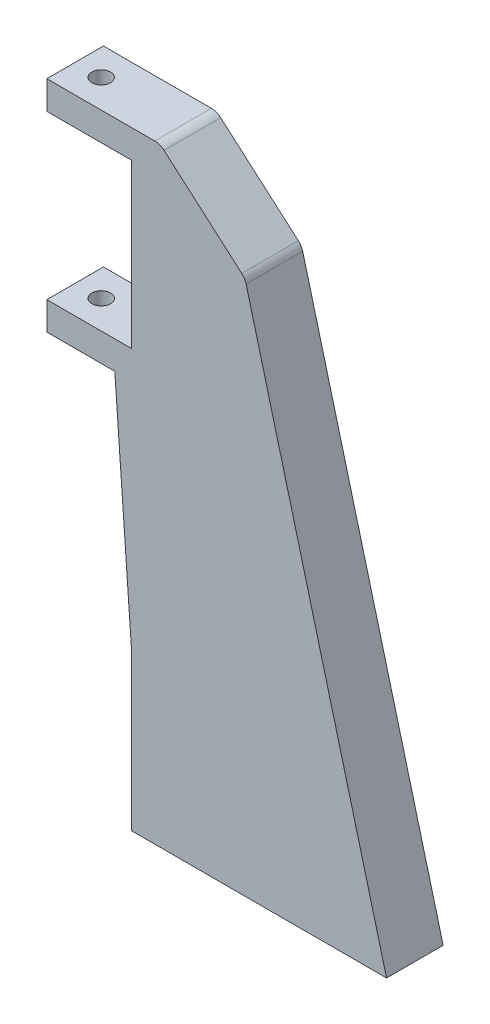
ISO-10303-21;
HEADER;
FILE_DESCRIPTION(('STEP AP214'),'2;1');
FILE_NAME('part.step','',(''),(''),'','','');
FILE_SCHEMA(('AUTOMOTIVE_DESIGN { 1 0 10303 214 1 1 1 1 }'));
ENDSEC;
DATA;
#1=APPLICATION_CONTEXT('core data for automotive mechanical design processes');
#2=APPLICATION_PROTOCOL_DEFINITION('international standard','automotive_design',2000,#1);
#3=PRODUCT_CONTEXT('',#1,'mechanical');
#4=PRODUCT('Part','Part','',(#3));
#5=PRODUCT_RELATED_PRODUCT_CATEGORY('part','',(#4));
#6=PRODUCT_DEFINITION_FORMATION('','',#4);
#7=PRODUCT_DEFINITION_CONTEXT('part definition',#1,'design');
#8=PRODUCT_DEFINITION('design','',#6,#7);
#9=PRODUCT_DEFINITION_SHAPE('','',#8);
#10=(LENGTH_UNIT() NAMED_UNIT(*) SI_UNIT(.MILLI.,.METRE.));
#11=(NAMED_UNIT(*) PLANE_ANGLE_UNIT() SI_UNIT($,.RADIAN.));
#12=(NAMED_UNIT(*) SI_UNIT($,.STERADIAN.) SOLID_ANGLE_UNIT());
#13=UNCERTAINTY_MEASURE_WITH_UNIT(LENGTH_MEASURE(1.E-05),#10,'distance_accuracy_value','');
#14=(GEOMETRIC_REPRESENTATION_CONTEXT(3) GLOBAL_UNCERTAINTY_ASSIGNED_CONTEXT((#13)) GLOBAL_UNIT_ASSIGNED_CONTEXT((#10,
#11,#12)) REPRESENTATION_CONTEXT('',''));
#15=CARTESIAN_POINT('',(0.,0.,0.));
#16=DIRECTION('',(0.,0.,1.));
#17=DIRECTION('',(1.,0.,0.));
#18=AXIS2_PLACEMENT_3D('',#15,#16,#17);
#19=CARTESIAN_POINT('',(0.,0.,25.4));
#20=DIRECTION('',(0.,1.,0.));
#21=DIRECTION('',(0.,0.,1.));
#22=AXIS2_PLACEMENT_3D('',#19,#20,#21);
#23=PLANE('',#22);
#24=CARTESIAN_POINT('',(11.684,0.,12.7));
#25=DIRECTION('',(0.,1.,0.));
#26=DIRECTION('',(0.,0.,1.));
#27=AXIS2_PLACEMENT_3D('',#24,#25,#26);
#28=CIRCLE('',#27,4.191);
#29=CARTESIAN_POINT('',(11.684,0.,16.891));
#30=VERTEX_POINT('',#29);
#31=EDGE_CURVE('E318',#30,#30,#28,.T.);
#32=ORIENTED_EDGE('',*,*,#31,.T.);
#33=EDGE_LOOP('',(#32));
#34=FACE_BOUND('',#33,.T.);
#35=DIRECTION('',(1.,0.,0.));
#36=VECTOR('',#35,1.);
#37=CARTESIAN_POINT('',(0.,0.,0.));
#38=LINE('',#37,#36);
#39=CARTESIAN_POINT('',(0.,0.,0.));
#40=VERTEX_POINT('',#39);
#41=CARTESIAN_POINT('',(38.0186594192209,0.,0.));
#42=VERTEX_POINT('',#41);
#43=EDGE_CURVE('E218',#40,#42,#38,.T.);
#44=ORIENTED_EDGE('',*,*,#43,.T.);
#45=DIRECTION('',(0.,0.,-1.));
#46=VECTOR('',#45,1.);
#47=CARTESIAN_POINT('',(38.0186594192209,0.,25.4));
#48=LINE('',#47,#46);
#49=CARTESIAN_POINT('',(38.0186594192209,0.,25.4));
#50=VERTEX_POINT('',#49);
#51=EDGE_CURVE('E198',#50,#42,#48,.T.);
#52=ORIENTED_EDGE('',*,*,#51,.F.);
#53=DIRECTION('',(1.,0.,0.));
#54=VECTOR('',#53,1.);
#55=CARTESIAN_POINT('',(0.,0.,25.4));
#56=LINE('',#55,#54);
#57=CARTESIAN_POINT('',(0.,0.,25.4));
#58=VERTEX_POINT('',#57);
#59=EDGE_CURVE('E205',#58,#50,#56,.T.);
#60=ORIENTED_EDGE('',*,*,#59,.F.);
#61=DIRECTION('',(0.,0.,-1.));
#62=VECTOR('',#61,1.);
#63=CARTESIAN_POINT('',(0.,0.,25.4));
#64=LINE('',#63,#62);
#65=EDGE_CURVE('E344',#58,#40,#64,.T.);
#66=ORIENTED_EDGE('',*,*,#65,.T.);
#67=EDGE_LOOP('',(#44,#52,#60,#66));
#68=FACE_BOUND('',#67,.T.);
#69=ADVANCED_FACE('F40',(#34,#68),#23,.F.);
#70=CARTESIAN_POINT('',(38.0186594192209,0.,25.4));
#71=DIRECTION('',(1.,0.,0.));
#72=DIRECTION('',(0.,0.,-1.));
#73=AXIS2_PLACEMENT_3D('',#70,#71,#72);
#74=PLANE('',#73);
#75=DIRECTION('',(0.,-1.,0.));
#76=VECTOR('',#75,1.);
#77=CARTESIAN_POINT('',(38.0186594192209,0.,0.));
#78=LINE('',#77,#76);
#79=CARTESIAN_POINT('',(38.0186594192209,-73.1522603664943,0.));
#80=VERTEX_POINT('',#79);
#81=EDGE_CURVE('E346',#42,#80,#78,.T.);
#82=ORIENTED_EDGE('',*,*,#81,.T.);
#83=DIRECTION('',(0.,0.,-1.));
#84=VECTOR('',#83,1.);
#85=CARTESIAN_POINT('',(38.0186594192209,-73.1522603664943,25.4));
#86=LINE('',#85,#84);
#87=CARTESIAN_POINT('',(38.0186594192209,-73.1522603664943,25.4));
#88=VERTEX_POINT('',#87);
#89=EDGE_CURVE('E201',#88,#80,#86,.T.);
#90=ORIENTED_EDGE('',*,*,#89,.F.);
#91=DIRECTION('',(0.,-1.,0.));
#92=VECTOR('',#91,1.);
#93=CARTESIAN_POINT('',(38.0186594192209,0.,25.4));
#94=LINE('',#93,#92);
#95=EDGE_CURVE('E194',#50,#88,#94,.T.);
#96=ORIENTED_EDGE('',*,*,#95,.F.);
#97=ORIENTED_EDGE('',*,*,#51,.T.);
#98=EDGE_LOOP('',(#82,#90,#96,#97));
#99=FACE_BOUND('',#98,.T.);
#100=ADVANCED_FACE('F196',(#99),#74,.F.);
#101=CARTESIAN_POINT('',(38.0186594192209,-73.1522603664943,25.4));
#102=DIRECTION('',(0.,-1.,0.));
#103=DIRECTION('',(0.,0.,-1.));
#104=AXIS2_PLACEMENT_3D('',#101,#102,#103);
#105=PLANE('',#104);
#106=CARTESIAN_POINT('',(11.684,-73.1522603664942,12.7));
#107=DIRECTION('',(0.,-1.,0.));
#108=DIRECTION('',(0.,0.,-1.));
#109=AXIS2_PLACEMENT_3D('',#106,#107,#108);
#110=CIRCLE('',#109,4.191);
#111=CARTESIAN_POINT('',(11.684,-73.1522603664942,8.509));
#112=VERTEX_POINT('',#111);
#113=EDGE_CURVE('E536',#112,#112,#110,.T.);
#114=ORIENTED_EDGE('',*,*,#113,.T.);
#115=EDGE_LOOP('',(#114));
#116=FACE_BOUND('',#115,.T.);
#117=DIRECTION('',(-1.,0.,0.));
#118=VECTOR('',#117,1.);
#119=CARTESIAN_POINT('',(38.0186594192209,-73.1522603664943,0.));
#120=LINE('',#119,#118);
#121=CARTESIAN_POINT('',(0.,-73.1522603664943,0.));
#122=VERTEX_POINT('',#121);
#123=EDGE_CURVE('E348',#80,#122,#120,.T.);
#124=ORIENTED_EDGE('',*,*,#123,.T.);
#125=DIRECTION('',(0.,0.,-1.));
#126=VECTOR('',#125,1.);
#127=CARTESIAN_POINT('',(0.,-73.1522603664943,25.4));
#128=LINE('',#127,#126);
#129=CARTESIAN_POINT('',(0.,-73.1522603664943,25.4));
#130=VERTEX_POINT('',#129);
#131=EDGE_CURVE('E224',#130,#122,#128,.T.);
#132=ORIENTED_EDGE('',*,*,#131,.F.);
#133=DIRECTION('',(-1.,0.,0.));
#134=VECTOR('',#133,1.);
#135=CARTESIAN_POINT('',(38.0186594192209,-73.1522603664943,25.4));
#136=LINE('',#135,#134);
#137=EDGE_CURVE('E204',#88,#130,#136,.T.);
#138=ORIENTED_EDGE('',*,*,#137,.F.);
#139=ORIENTED_EDGE('',*,*,#89,.T.);
#140=EDGE_LOOP('',(#124,#132,#138,#139));
#141=FACE_BOUND('',#140,.T.);
#142=ADVANCED_FACE('F444',(#116,#141),#105,.F.);
#143=CARTESIAN_POINT('',(0.,-73.1522603664943,25.4));
#144=DIRECTION('',(1.,0.,0.));
#145=DIRECTION('',(0.,0.,-1.));
#146=AXIS2_PLACEMENT_3D('',#143,#144,#145);
#147=PLANE('',#146);
#148=DIRECTION('',(0.,-1.,0.));
#149=VECTOR('',#148,1.);
#150=CARTESIAN_POINT('',(0.,-73.1522603664943,0.));
#151=LINE('',#150,#149);
#152=CARTESIAN_POINT('',(0.,-85.7639267927339,0.));
#153=VERTEX_POINT('',#152);
#154=EDGE_CURVE('E350',#122,#153,#151,.T.);
#155=ORIENTED_EDGE('',*,*,#154,.T.);
#156=DIRECTION('',(0.,0.,-1.));
#157=VECTOR('',#156,1.);
#158=CARTESIAN_POINT('',(0.,-85.7639267927339,25.4));
#159=LINE('',#158,#157);
#160=CARTESIAN_POINT('',(0.,-85.7639267927339,25.4));
#161=VERTEX_POINT('',#160);
#162=EDGE_CURVE('E383',#161,#153,#159,.T.);
#163=ORIENTED_EDGE('',*,*,#162,.F.);
#164=DIRECTION('',(0.,-1.,0.));
#165=VECTOR('',#164,1.);
#166=CARTESIAN_POINT('',(0.,-73.1522603664943,25.4));
#167=LINE('',#166,#165);
#168=EDGE_CURVE('E325',#130,#161,#167,.T.);
#169=ORIENTED_EDGE('',*,*,#168,.F.);
#170=ORIENTED_EDGE('',*,*,#131,.T.);
#171=EDGE_LOOP('',(#155,#163,#169,#170));
#172=FACE_BOUND('',#171,.T.);
#173=ADVANCED_FACE('F390',(#172),#147,.F.);
#174=CARTESIAN_POINT('',(0.,-85.7639267927339,25.4));
#175=DIRECTION('',(0.,1.,0.));
#176=DIRECTION('',(0.,0.,1.));
#177=AXIS2_PLACEMENT_3D('',#174,#175,#176);
#178=PLANE('',#177);
#179=CARTESIAN_POINT('',(11.684,-85.7639267927339,12.7));
#180=DIRECTION('',(0.,1.,0.));
#181=DIRECTION('',(0.,0.,1.));
#182=AXIS2_PLACEMENT_3D('',#179,#180,#181);
#183=CIRCLE('',#182,4.191);
#184=CARTESIAN_POINT('',(11.684,-85.7639267927339,16.891));
#185=VERTEX_POINT('',#184);
#186=EDGE_CURVE('E534',#185,#185,#183,.T.);
#187=ORIENTED_EDGE('',*,*,#186,.T.);
#188=EDGE_LOOP('',(#187));
#189=FACE_BOUND('',#188,.T.);
#190=DIRECTION('',(1.,0.,0.));
#191=VECTOR('',#190,1.);
#192=CARTESIAN_POINT('',(0.,-85.7639267927339,0.));
#193=LINE('',#192,#191);
#194=CARTESIAN_POINT('',(30.48,-85.7639267927339,0.));
#195=VERTEX_POINT('',#194);
#196=EDGE_CURVE('E352',#153,#195,#193,.T.);
#197=ORIENTED_EDGE('',*,*,#196,.T.);
#198=DIRECTION('',(0.,0.,-1.));
#199=VECTOR('',#198,1.);
#200=CARTESIAN_POINT('',(30.48,-85.7639267927339,25.4));
#201=LINE('',#200,#199);
#202=CARTESIAN_POINT('',(30.48,-85.7639267927339,25.4));
#203=VERTEX_POINT('',#202);
#204=EDGE_CURVE('E380',#203,#195,#201,.T.);
#205=ORIENTED_EDGE('',*,*,#204,.F.);
#206=DIRECTION('',(1.,0.,0.));
#207=VECTOR('',#206,1.);
#208=CARTESIAN_POINT('',(0.,-85.7639267927339,25.4));
#209=LINE('',#208,#207);
#210=EDGE_CURVE('E327',#161,#203,#209,.T.);
#211=ORIENTED_EDGE('',*,*,#210,.F.);
#212=ORIENTED_EDGE('',*,*,#162,.T.);
#213=EDGE_LOOP('',(#197,#205,#211,#212));
#214=FACE_BOUND('',#213,.T.);
#215=ADVANCED_FACE('F399',(#189,#214),#178,.F.);
#216=CARTESIAN_POINT('',(30.48,-85.7639267927339,25.4));
#217=DIRECTION('',(0.997429246927339,0.071658198232729,0.));
#218=DIRECTION('',(-0.071658198232729,0.997429246927339,0.));
#219=AXIS2_PLACEMENT_3D('',#216,#217,#218);
#220=PLANE('',#219);
#221=DIRECTION('',(0.071658198232729,-0.997429246927339,0.));
#222=VECTOR('',#221,1.);
#223=CARTESIAN_POINT('',(30.48,-85.7639267927339,0.));
#224=LINE('',#223,#222);
#225=CARTESIAN_POINT('',(38.0023351372095,-190.469281603275,0.));
#226=VERTEX_POINT('',#225);
#227=EDGE_CURVE('E354',#195,#226,#224,.T.);
#228=ORIENTED_EDGE('',*,*,#227,.T.);
#229=DIRECTION('',(0.,0.,-1.));
#230=VECTOR('',#229,1.);
#231=CARTESIAN_POINT('',(38.0023351372095,-190.469281603275,25.4));
#232=LINE('',#231,#230);
#233=CARTESIAN_POINT('',(38.0023351372095,-190.469281603275,25.4));
#234=VERTEX_POINT('',#233);
#235=EDGE_CURVE('E222',#226,#234,#232,.F.);
#236=ORIENTED_EDGE('',*,*,#235,.T.);
#237=DIRECTION('',(0.071658198232729,-0.997429246927339,0.));
#238=VECTOR('',#237,1.);
#239=CARTESIAN_POINT('',(30.48,-85.7639267927339,25.4));
#240=LINE('',#239,#238);
#241=EDGE_CURVE('E329',#203,#234,#240,.T.);
#242=ORIENTED_EDGE('',*,*,#241,.F.);
#243=ORIENTED_EDGE('',*,*,#204,.T.);
#244=EDGE_LOOP('',(#228,#236,#242,#243));
#245=FACE_BOUND('',#244,.T.);
#246=ADVANCED_FACE('F403',(#245),#220,.F.);
#247=CARTESIAN_POINT('',(38.0186594192209,-190.696503564123,25.4));
#248=DIRECTION('',(1.,0.,0.));
#249=DIRECTION('',(0.,0.,-1.));
#250=AXIS2_PLACEMENT_3D('',#247,#248,#249);
#251=PLANE('',#250);
#252=DIRECTION('',(0.,-1.,0.));
#253=VECTOR('',#252,1.);
#254=CARTESIAN_POINT('',(38.0186594192209,-190.696503564123,25.4));
#255=LINE('',#254,#253);
#256=CARTESIAN_POINT('',(38.0186594192209,-190.924311162053,25.4));
#257=VERTEX_POINT('',#256);
#258=CARTESIAN_POINT('',(38.0186594192209,-260.515926792734,25.4));
#259=VERTEX_POINT('',#258);
#260=EDGE_CURVE('E332',#257,#259,#255,.T.);
#261=ORIENTED_EDGE('',*,*,#260,.F.);
#262=DIRECTION('',(0.,0.,-1.));
#263=VECTOR('',#262,1.);
#264=CARTESIAN_POINT('',(38.0186594192209,-190.924311162053,0.));
#265=LINE('',#264,#263);
#266=CARTESIAN_POINT('',(38.0186594192209,-190.924311162053,0.));
#267=VERTEX_POINT('',#266);
#268=EDGE_CURVE('E219',#257,#267,#265,.T.);
#269=ORIENTED_EDGE('',*,*,#268,.T.);
#270=DIRECTION('',(0.,-1.,0.));
#271=VECTOR('',#270,1.);
#272=CARTESIAN_POINT('',(38.0186594192209,-190.696503564123,0.));
#273=LINE('',#272,#271);
#274=CARTESIAN_POINT('',(38.0186594192209,-260.515926792734,0.));
#275=VERTEX_POINT('',#274);
#276=EDGE_CURVE('E357',#267,#275,#273,.T.);
#277=ORIENTED_EDGE('',*,*,#276,.T.);
#278=DIRECTION('',(0.,0.,-1.));
#279=VECTOR('',#278,1.);
#280=CARTESIAN_POINT('',(38.0186594192209,-260.515926792734,25.4));
#281=LINE('',#280,#279);
#282=EDGE_CURVE('E377',#259,#275,#281,.T.);
#283=ORIENTED_EDGE('',*,*,#282,.F.);
#284=EDGE_LOOP('',(#261,#269,#277,#283));
#285=FACE_BOUND('',#284,.T.);
#286=ADVANCED_FACE('F412',(#285),#251,.F.);
#287=CARTESIAN_POINT('',(38.0186594192209,-260.515926792734,25.4));
#288=DIRECTION('',(0.,1.,0.));
#289=DIRECTION('',(-1.,0.,0.));
#290=AXIS2_PLACEMENT_3D('',#287,#288,#289);
#291=PLANE('',#290);
#292=CARTESIAN_POINT('',(139.7,-260.515926792734,12.7));
#293=DIRECTION('',(0.,-1.,0.));
#294=DIRECTION('',(1.,0.,0.));
#295=AXIS2_PLACEMENT_3D('',#292,#293,#294);
#296=CIRCLE('',#295,4.191);
#297=CARTESIAN_POINT('',(143.891,-260.515926792734,12.7));
#298=VERTEX_POINT('',#297);
#299=EDGE_CURVE('E755',#298,#298,#296,.T.);
#300=ORIENTED_EDGE('',*,*,#299,.F.);
#301=EDGE_LOOP('',(#300));
#302=FACE_BOUND('',#301,.T.);
#303=CARTESIAN_POINT('',(63.5,-260.515926792734,11.816556530138));
#304=DIRECTION('',(0.,-1.,0.));
#305=DIRECTION('',(1.,0.,0.));
#306=AXIS2_PLACEMENT_3D('',#303,#304,#305);
#307=CIRCLE('',#306,4.191);
#308=CARTESIAN_POINT('',(67.691,-260.515926792734,11.816556530138));
#309=VERTEX_POINT('',#308);
#310=EDGE_CURVE('E753',#309,#309,#307,.T.);
#311=ORIENTED_EDGE('',*,*,#310,.F.);
#312=EDGE_LOOP('',(#311));
#313=FACE_BOUND('',#312,.T.);
#314=DIRECTION('',(1.,0.,0.));
#315=VECTOR('',#314,1.);
#316=CARTESIAN_POINT('',(38.0186594192209,-260.515926792734,0.));
#317=LINE('',#316,#315);
#318=CARTESIAN_POINT('',(152.4,-260.515926792734,0.));
#319=VERTEX_POINT('',#318);
#320=EDGE_CURVE('E359',#275,#319,#317,.T.);
#321=ORIENTED_EDGE('',*,*,#320,.T.);
#322=DIRECTION('',(0.,0.,-1.));
#323=VECTOR('',#322,1.);
#324=CARTESIAN_POINT('',(152.4,-260.515926792734,25.4));
#325=LINE('',#324,#323);
#326=CARTESIAN_POINT('',(152.4,-260.515926792734,25.4));
#327=VERTEX_POINT('',#326);
#328=EDGE_CURVE('E374',#327,#319,#325,.T.);
#329=ORIENTED_EDGE('',*,*,#328,.F.);
#330=DIRECTION('',(1.,0.,0.));
#331=VECTOR('',#330,1.);
#332=CARTESIAN_POINT('',(38.0186594192209,-260.515926792734,25.4));
#333=LINE('',#332,#331);
#334=EDGE_CURVE('E334',#259,#327,#333,.T.);
#335=ORIENTED_EDGE('',*,*,#334,.F.);
#336=ORIENTED_EDGE('',*,*,#282,.T.);
#337=EDGE_LOOP('',(#321,#329,#335,#336));
#338=FACE_BOUND('',#337,.T.);
#339=ADVANCED_FACE('F418',(#302,#313,#338),#291,.F.);
#340=CARTESIAN_POINT('',(152.4,-260.515926792734,25.4));
#341=DIRECTION('',(-0.966736029953068,-0.255776168535266,0.));
#342=DIRECTION('',(0.255776168535266,-0.966736029953068,0.));
#343=AXIS2_PLACEMENT_3D('',#340,#341,#342);
#344=PLANE('',#343);
#345=DIRECTION('',(-0.255776168535266,0.966736029953068,0.));
#346=VECTOR('',#345,1.);
#347=CARTESIAN_POINT('',(152.4,-260.515926792734,0.));
#348=LINE('',#347,#346);
#349=CARTESIAN_POINT('',(89.3981591637287,-22.3930796229651,0.));
#350=VERTEX_POINT('',#349);
#351=EDGE_CURVE('E361',#319,#350,#348,.T.);
#352=ORIENTED_EDGE('',*,*,#351,.T.);
#353=DIRECTION('',(0.,0.,-1.));
#354=VECTOR('',#353,1.);
#355=CARTESIAN_POINT('',(89.3981591637287,-22.393079622965,25.4));
#356=LINE('',#355,#354);
#357=CARTESIAN_POINT('',(89.3981591637287,-22.3930796229651,25.4));
#358=VERTEX_POINT('',#357);
#359=EDGE_CURVE('E238',#350,#358,#356,.F.);
#360=ORIENTED_EDGE('',*,*,#359,.T.);
#361=DIRECTION('',(-0.255776168535266,0.966736029953068,0.));
#362=VECTOR('',#361,1.);
#363=CARTESIAN_POINT('',(152.4,-260.515926792734,25.4));
#364=LINE('',#363,#362);
#365=EDGE_CURVE('E336',#327,#358,#364,.T.);
#366=ORIENTED_EDGE('',*,*,#365,.F.);
#367=ORIENTED_EDGE('',*,*,#328,.T.);
#368=EDGE_LOOP('',(#352,#360,#366,#367));
#369=FACE_BOUND('',#368,.T.);
#370=ADVANCED_FACE('F422',(#369),#344,.F.);
#371=CARTESIAN_POINT('',(50.8,12.7,25.4));
#372=DIRECTION('',(-0.657077237358178,-0.753823257896534,0.));
#373=DIRECTION('',(0.753823257896534,-0.657077237358178,0.));
#374=AXIS2_PLACEMENT_3D('',#371,#372,#373);
#375=PLANE('',#374);
#376=DIRECTION('',(-0.753823257896534,0.657077237358178,0.));
#377=VECTOR('',#376,1.);
#378=CARTESIAN_POINT('',(50.8,12.7,25.4));
#379=LINE('',#378,#377);
#380=CARTESIAN_POINT('',(87.4318258307511,-19.230480605521,25.4));
#381=VERTEX_POINT('',#380);
#382=CARTESIAN_POINT('',(52.5933863316515,11.136777687643,25.4));
#383=VERTEX_POINT('',#382);
#384=EDGE_CURVE('E338',#381,#383,#379,.T.);
#385=ORIENTED_EDGE('',*,*,#384,.F.);
#386=DIRECTION('',(0.,0.,-1.));
#387=VECTOR('',#386,1.);
#388=CARTESIAN_POINT('',(87.4318258307511,-19.230480605521,25.4));
#389=LINE('',#388,#387);
#390=CARTESIAN_POINT('',(87.4318258307511,-19.230480605521,0.));
#391=VERTEX_POINT('',#390);
#392=EDGE_CURVE('E231',#381,#391,#389,.T.);
#393=ORIENTED_EDGE('',*,*,#392,.T.);
#394=DIRECTION('',(-0.753823257896534,0.657077237358178,0.));
#395=VECTOR('',#394,1.);
#396=CARTESIAN_POINT('',(50.8,12.7,0.));
#397=LINE('',#396,#395);
#398=CARTESIAN_POINT('',(52.5933863316515,11.136777687643,0.));
#399=VERTEX_POINT('',#398);
#400=EDGE_CURVE('E364',#391,#399,#397,.T.);
#401=ORIENTED_EDGE('',*,*,#400,.T.);
#402=DIRECTION('',(0.,0.,-1.));
#403=VECTOR('',#402,1.);
#404=CARTESIAN_POINT('',(52.5933863316515,11.136777687643,25.4));
#405=LINE('',#404,#403);
#406=EDGE_CURVE('E229',#399,#383,#405,.F.);
#407=ORIENTED_EDGE('',*,*,#406,.T.);
#408=EDGE_LOOP('',(#385,#393,#401,#407));
#409=FACE_BOUND('',#408,.T.);
#410=ADVANCED_FACE('F430',(#409),#375,.F.);
#411=CARTESIAN_POINT('',(0.,12.7,25.4));
#412=DIRECTION('',(0.,-1.,0.));
#413=DIRECTION('',(0.,0.,-1.));
#414=AXIS2_PLACEMENT_3D('',#411,#412,#413);
#415=PLANE('',#414);
#416=CARTESIAN_POINT('',(11.684,12.7,12.7));
#417=DIRECTION('',(0.,1.,0.));
#418=DIRECTION('',(0.,0.,1.));
#419=AXIS2_PLACEMENT_3D('',#416,#417,#418);
#420=CIRCLE('',#419,4.191);
#421=CARTESIAN_POINT('',(11.684,12.7,16.891));
#422=VERTEX_POINT('',#421);
#423=EDGE_CURVE('E537',#422,#422,#420,.T.);
#424=ORIENTED_EDGE('',*,*,#423,.F.);
#425=EDGE_LOOP('',(#424));
#426=FACE_BOUND('',#425,.T.);
#427=DIRECTION('',(-1.,0.,0.));
#428=VECTOR('',#427,1.);
#429=CARTESIAN_POINT('',(0.,12.7,25.4));
#430=LINE('',#429,#428);
#431=CARTESIAN_POINT('',(48.4209458744271,12.7,25.4));
#432=VERTEX_POINT('',#431);
#433=CARTESIAN_POINT('',(0.,12.7,25.4));
#434=VERTEX_POINT('',#433);
#435=EDGE_CURVE('E341',#432,#434,#430,.T.);
#436=ORIENTED_EDGE('',*,*,#435,.F.);
#437=DIRECTION('',(0.,0.,-1.));
#438=VECTOR('',#437,1.);
#439=CARTESIAN_POINT('',(48.4209458744271,12.7,25.4));
#440=LINE('',#439,#438);
#441=CARTESIAN_POINT('',(48.4209458744271,12.7,0.));
#442=VERTEX_POINT('',#441);
#443=EDGE_CURVE('E244',#432,#442,#440,.T.);
#444=ORIENTED_EDGE('',*,*,#443,.T.);
#445=DIRECTION('',(-1.,0.,0.));
#446=VECTOR('',#445,1.);
#447=CARTESIAN_POINT('',(0.,12.7,0.));
#448=LINE('',#447,#446);
#449=CARTESIAN_POINT('',(0.,12.7,0.));
#450=VERTEX_POINT('',#449);
#451=EDGE_CURVE('E367',#442,#450,#448,.T.);
#452=ORIENTED_EDGE('',*,*,#451,.T.);
#453=DIRECTION('',(0.,0.,-1.));
#454=VECTOR('',#453,1.);
#455=CARTESIAN_POINT('',(0.,12.7,25.4));
#456=LINE('',#455,#454);
#457=EDGE_CURVE('E371',#434,#450,#456,.T.);
#458=ORIENTED_EDGE('',*,*,#457,.F.);
#459=EDGE_LOOP('',(#436,#444,#452,#458));
#460=FACE_BOUND('',#459,.T.);
#461=ADVANCED_FACE('F440',(#426,#460),#415,.F.);
#462=CARTESIAN_POINT('',(0.,0.,25.4));
#463=DIRECTION('',(1.,0.,0.));
#464=DIRECTION('',(0.,0.,-1.));
#465=AXIS2_PLACEMENT_3D('',#462,#463,#464);
#466=PLANE('',#465);
#467=DIRECTION('',(0.,-1.,0.));
#468=VECTOR('',#467,1.);
#469=CARTESIAN_POINT('',(0.,0.,0.));
#470=LINE('',#469,#468);
#471=EDGE_CURVE('E215',#450,#40,#470,.T.);
#472=ORIENTED_EDGE('',*,*,#471,.T.);
#473=ORIENTED_EDGE('',*,*,#65,.F.);
#474=DIRECTION('',(0.,-1.,0.));
#475=VECTOR('',#474,1.);
#476=CARTESIAN_POINT('',(0.,0.,25.4));
#477=LINE('',#476,#475);
#478=EDGE_CURVE('E211',#434,#58,#477,.T.);
#479=ORIENTED_EDGE('',*,*,#478,.F.);
#480=ORIENTED_EDGE('',*,*,#457,.T.);
#481=EDGE_LOOP('',(#472,#473,#479,#480));
#482=FACE_BOUND('',#481,.T.);
#483=ADVANCED_FACE('F443',(#482),#466,.F.);
#484=CARTESIAN_POINT('',(0.,0.,25.4));
#485=DIRECTION('',(0.,0.,-1.));
#486=DIRECTION('',(-1.,0.,0.));
#487=AXIS2_PLACEMENT_3D('',#484,#485,#486);
#488=PLANE('',#487);
#489=ORIENTED_EDGE('',*,*,#365,.T.);
#490=CARTESIAN_POINT('',(83.2593853735267,-24.017258293164,25.4));
#491=DIRECTION('',(0.,0.,-1.));
#492=DIRECTION('',(-1.,0.,0.));
#493=AXIS2_PLACEMENT_3D('',#490,#491,#492);
#494=CIRCLE('',#493,6.35);
#495=EDGE_CURVE('E242',#358,#381,#494,.F.);
#496=ORIENTED_EDGE('',*,*,#495,.T.);
#497=ORIENTED_EDGE('',*,*,#384,.T.);
#498=CARTESIAN_POINT('',(48.4209458744271,6.35,25.4));
#499=DIRECTION('',(0.,0.,-1.));
#500=DIRECTION('',(-1.,0.,0.));
#501=AXIS2_PLACEMENT_3D('',#498,#499,#500);
#502=CIRCLE('',#501,6.35);
#503=EDGE_CURVE('E240',#383,#432,#502,.F.);
#504=ORIENTED_EDGE('',*,*,#503,.T.);
#505=ORIENTED_EDGE('',*,*,#435,.T.);
#506=ORIENTED_EDGE('',*,*,#478,.T.);
#507=ORIENTED_EDGE('',*,*,#59,.T.);
#508=ORIENTED_EDGE('',*,*,#95,.T.);
#509=ORIENTED_EDGE('',*,*,#137,.T.);
#510=ORIENTED_EDGE('',*,*,#168,.T.);
#511=ORIENTED_EDGE('',*,*,#210,.T.);
#512=ORIENTED_EDGE('',*,*,#241,.T.);
#513=CARTESIAN_POINT('',(31.6686594192209,-190.924311162053,25.4));
#514=DIRECTION('',(0.,0.,-1.));
#515=DIRECTION('',(-1.,0.,0.));
#516=AXIS2_PLACEMENT_3D('',#513,#514,#515);
#517=CIRCLE('',#516,6.35);
#518=EDGE_CURVE('E249',#234,#257,#517,.T.);
#519=ORIENTED_EDGE('',*,*,#518,.T.);
#520=ORIENTED_EDGE('',*,*,#260,.T.);
#521=ORIENTED_EDGE('',*,*,#334,.T.);
#522=EDGE_LOOP('',(#489,#496,#497,#504,#505,#506,#507,#508,#509,#510,#511,#512,#519,#520,#521));
#523=FACE_BOUND('',#522,.T.);
#524=ADVANCED_FACE('F209',(#523),#488,.F.);
#525=CARTESIAN_POINT('',(0.,0.,0.));
#526=DIRECTION('',(0.,0.,-1.));
#527=DIRECTION('',(-1.,0.,0.));
#528=AXIS2_PLACEMENT_3D('',#525,#526,#527);
#529=PLANE('',#528);
#530=DIRECTION('',(0.,-1.,0.));
#531=VECTOR('',#530,1.);
#532=CARTESIAN_POINT('',(101.518659419221,-144.437926792734,0.));
#533=LINE('',#532,#531);
#534=CARTESIAN_POINT('',(101.518659419221,-147.612926792734,0.));
#535=VERTEX_POINT('',#534);
#536=CARTESIAN_POINT('',(101.518659419221,-179.362926792734,0.));
#537=VERTEX_POINT('',#536);
#538=EDGE_CURVE('E315',#535,#537,#533,.T.);
#539=ORIENTED_EDGE('',*,*,#538,.F.);
#540=CARTESIAN_POINT('',(98.343659419221,-147.612926792734,0.));
#541=DIRECTION('',(0.,0.,-1.));
#542=DIRECTION('',(-1.,0.,0.));
#543=AXIS2_PLACEMENT_3D('',#540,#541,#542);
#544=CIRCLE('',#543,3.175);
#545=CARTESIAN_POINT('',(98.343659419221,-144.437926792734,0.));
#546=VERTEX_POINT('',#545);
#547=EDGE_CURVE('E12',#535,#546,#544,.F.);
#548=ORIENTED_EDGE('',*,*,#547,.T.);
#549=DIRECTION('',(1.,0.,0.));
#550=VECTOR('',#549,1.);
#551=CARTESIAN_POINT('',(101.518659419221,-144.437926792734,0.));
#552=LINE('',#551,#550);
#553=CARTESIAN_POINT('',(66.593659419221,-144.437926792734,0.));
#554=VERTEX_POINT('',#553);
#555=EDGE_CURVE('E286',#554,#546,#552,.T.);
#556=ORIENTED_EDGE('',*,*,#555,.F.);
#557=CARTESIAN_POINT('',(66.593659419221,-147.612926792734,0.));
#558=DIRECTION('',(0.,0.,-1.));
#559=DIRECTION('',(-1.,0.,0.));
#560=AXIS2_PLACEMENT_3D('',#557,#558,#559);
#561=CIRCLE('',#560,3.175);
#562=CARTESIAN_POINT('',(63.418659419221,-147.612926792734,0.));
#563=VERTEX_POINT('',#562);
#564=EDGE_CURVE('E48',#554,#563,#561,.F.);
#565=ORIENTED_EDGE('',*,*,#564,.T.);
#566=DIRECTION('',(0.,1.,0.));
#567=VECTOR('',#566,1.);
#568=CARTESIAN_POINT('',(63.418659419221,-144.437926792734,0.));
#569=LINE('',#568,#567);
#570=CARTESIAN_POINT('',(63.418659419221,-179.362926792734,0.));
#571=VERTEX_POINT('',#570);
#572=EDGE_CURVE('E285',#571,#563,#569,.T.);
#573=ORIENTED_EDGE('',*,*,#572,.F.);
#574=CARTESIAN_POINT('',(66.593659419221,-179.362926792734,0.));
#575=DIRECTION('',(0.,0.,-1.));
#576=DIRECTION('',(-1.,0.,0.));
#577=AXIS2_PLACEMENT_3D('',#574,#575,#576);
#578=CIRCLE('',#577,3.175);
#579=CARTESIAN_POINT('',(66.593659419221,-182.537926792734,0.));
#580=VERTEX_POINT('',#579);
#581=EDGE_CURVE('E280',#571,#580,#578,.F.);
#582=ORIENTED_EDGE('',*,*,#581,.T.);
#583=DIRECTION('',(-1.,0.,0.));
#584=VECTOR('',#583,1.);
#585=CARTESIAN_POINT('',(101.518659419221,-182.537926792734,0.));
#586=LINE('',#585,#584);
#587=CARTESIAN_POINT('',(98.343659419221,-182.537926792734,0.));
#588=VERTEX_POINT('',#587);
#589=EDGE_CURVE('E292',#588,#580,#586,.T.);
#590=ORIENTED_EDGE('',*,*,#589,.F.);
#591=CARTESIAN_POINT('',(98.343659419221,-179.362926792734,0.));
#592=DIRECTION('',(0.,0.,-1.));
#593=DIRECTION('',(-1.,0.,0.));
#594=AXIS2_PLACEMENT_3D('',#591,#592,#593);
#595=CIRCLE('',#594,3.175);
#596=EDGE_CURVE('E278',#588,#537,#595,.F.);
#597=ORIENTED_EDGE('',*,*,#596,.T.);
#598=EDGE_LOOP('',(#539,#548,#556,#565,#573,#582,#590,#597));
#599=FACE_BOUND('',#598,.T.);
#600=ORIENTED_EDGE('',*,*,#400,.F.);
#601=CARTESIAN_POINT('',(83.2593853735267,-24.017258293164,0.));
#602=DIRECTION('',(0.,0.,-1.));
#603=DIRECTION('',(-1.,0.,0.));
#604=AXIS2_PLACEMENT_3D('',#601,#602,#603);
#605=CIRCLE('',#604,6.35);
#606=EDGE_CURVE('E236',#391,#350,#605,.T.);
#607=ORIENTED_EDGE('',*,*,#606,.T.);
#608=ORIENTED_EDGE('',*,*,#351,.F.);
#609=ORIENTED_EDGE('',*,*,#320,.F.);
#610=ORIENTED_EDGE('',*,*,#276,.F.);
#611=CARTESIAN_POINT('',(31.6686594192209,-190.924311162053,0.));
#612=DIRECTION('',(0.,0.,-1.));
#613=DIRECTION('',(-1.,0.,0.));
#614=AXIS2_PLACEMENT_3D('',#611,#612,#613);
#615=CIRCLE('',#614,6.35);
#616=EDGE_CURVE('E247',#267,#226,#615,.F.);
#617=ORIENTED_EDGE('',*,*,#616,.T.);
#618=ORIENTED_EDGE('',*,*,#227,.F.);
#619=ORIENTED_EDGE('',*,*,#196,.F.);
#620=ORIENTED_EDGE('',*,*,#154,.F.);
#621=ORIENTED_EDGE('',*,*,#123,.F.);
#622=ORIENTED_EDGE('',*,*,#81,.F.);
#623=ORIENTED_EDGE('',*,*,#43,.F.);
#624=ORIENTED_EDGE('',*,*,#471,.F.);
#625=ORIENTED_EDGE('',*,*,#451,.F.);
#626=CARTESIAN_POINT('',(48.4209458744271,6.35,0.));
#627=DIRECTION('',(0.,0.,-1.));
#628=DIRECTION('',(-1.,0.,0.));
#629=AXIS2_PLACEMENT_3D('',#626,#627,#628);
#630=CIRCLE('',#629,6.35);
#631=EDGE_CURVE('E234',#442,#399,#630,.T.);
#632=ORIENTED_EDGE('',*,*,#631,.T.);
#633=EDGE_LOOP('',(#600,#607,#608,#609,#610,#617,#618,#619,#620,#621,#622,#623,#624,#625,#632));
#634=FACE_BOUND('',#633,.T.);
#635=ADVANCED_FACE('F283',(#599,#634),#529,.T.);
#636=CARTESIAN_POINT('',(101.518659419221,-144.437926792734,79.2815367264149));
#637=DIRECTION('',(1.,0.,0.));
#638=DIRECTION('',(0.,1.,0.));
#639=AXIS2_PLACEMENT_3D('',#636,#637,#638);
#640=PLANE('',#639);
#641=ORIENTED_EDGE('',*,*,#538,.T.);
#642=DIRECTION('',(0.,0.,-1.));
#643=VECTOR('',#642,1.);
#644=CARTESIAN_POINT('',(101.518659419221,-179.362926792734,12.7));
#645=LINE('',#644,#643);
#646=CARTESIAN_POINT('',(101.518659419221,-179.362926792734,12.7));
#647=VERTEX_POINT('',#646);
#648=EDGE_CURVE('E259',#537,#647,#645,.F.);
#649=ORIENTED_EDGE('',*,*,#648,.T.);
#650=DIRECTION('',(0.,1.,0.));
#651=VECTOR('',#650,1.);
#652=CARTESIAN_POINT('',(101.518659419221,-144.437926792734,12.7));
#653=LINE('',#652,#651);
#654=CARTESIAN_POINT('',(101.518659419221,-147.612926792734,12.7));
#655=VERTEX_POINT('',#654);
#656=EDGE_CURVE('E307',#647,#655,#653,.T.);
#657=ORIENTED_EDGE('',*,*,#656,.T.);
#658=DIRECTION('',(0.,0.,-1.));
#659=VECTOR('',#658,1.);
#660=CARTESIAN_POINT('',(101.518659419221,-147.612926792734,0.));
#661=LINE('',#660,#659);
#662=EDGE_CURVE('E256',#655,#535,#661,.T.);
#663=ORIENTED_EDGE('',*,*,#662,.T.);
#664=EDGE_LOOP('',(#641,#649,#657,#663));
#665=FACE_BOUND('',#664,.T.);
#666=ADVANCED_FACE('F486',(#665),#640,.F.);
#667=CARTESIAN_POINT('',(101.518659419221,-144.437926792734,79.2815367264149));
#668=DIRECTION('',(0.,1.,0.));
#669=DIRECTION('',(0.,0.,1.));
#670=AXIS2_PLACEMENT_3D('',#667,#668,#669);
#671=PLANE('',#670);
#672=DIRECTION('',(-1.,0.,0.));
#673=VECTOR('',#672,1.);
#674=CARTESIAN_POINT('',(101.518659419221,-144.437926792734,12.7));
#675=LINE('',#674,#673);
#676=CARTESIAN_POINT('',(98.343659419221,-144.437926792734,12.7));
#677=VERTEX_POINT('',#676);
#678=CARTESIAN_POINT('',(66.593659419221,-144.437926792734,12.7));
#679=VERTEX_POINT('',#678);
#680=EDGE_CURVE('E301',#677,#679,#675,.T.);
#681=ORIENTED_EDGE('',*,*,#680,.T.);
#682=DIRECTION('',(0.,0.,-1.));
#683=VECTOR('',#682,1.);
#684=CARTESIAN_POINT('',(66.593659419221,-144.437926792734,0.));
#685=LINE('',#684,#683);
#686=EDGE_CURVE('E276',#679,#554,#685,.T.);
#687=ORIENTED_EDGE('',*,*,#686,.T.);
#688=ORIENTED_EDGE('',*,*,#555,.T.);
#689=DIRECTION('',(0.,0.,-1.));
#690=VECTOR('',#689,1.);
#691=CARTESIAN_POINT('',(98.343659419221,-144.437926792734,12.7));
#692=LINE('',#691,#690);
#693=EDGE_CURVE('E274',#546,#677,#692,.F.);
#694=ORIENTED_EDGE('',*,*,#693,.T.);
#695=EDGE_LOOP('',(#681,#687,#688,#694));
#696=FACE_BOUND('',#695,.T.);
#697=ADVANCED_FACE('F305',(#696),#671,.F.);
#698=CARTESIAN_POINT('',(63.418659419221,-144.437926792734,79.2815367264149));
#699=DIRECTION('',(-1.,0.,0.));
#700=DIRECTION('',(0.,0.,1.));
#701=AXIS2_PLACEMENT_3D('',#698,#699,#700);
#702=PLANE('',#701);
#703=DIRECTION('',(0.,-1.,0.));
#704=VECTOR('',#703,1.);
#705=CARTESIAN_POINT('',(63.418659419221,-144.437926792734,12.7));
#706=LINE('',#705,#704);
#707=CARTESIAN_POINT('',(63.418659419221,-147.612926792734,12.7));
#708=VERTEX_POINT('',#707);
#709=CARTESIAN_POINT('',(63.418659419221,-179.362926792734,12.7));
#710=VERTEX_POINT('',#709);
#711=EDGE_CURVE('E303',#708,#710,#706,.T.);
#712=ORIENTED_EDGE('',*,*,#711,.T.);
#713=DIRECTION('',(0.,0.,-1.));
#714=VECTOR('',#713,1.);
#715=CARTESIAN_POINT('',(63.418659419221,-179.362926792734,0.));
#716=LINE('',#715,#714);
#717=EDGE_CURVE('E271',#710,#571,#716,.T.);
#718=ORIENTED_EDGE('',*,*,#717,.T.);
#719=ORIENTED_EDGE('',*,*,#572,.T.);
#720=DIRECTION('',(0.,0.,-1.));
#721=VECTOR('',#720,1.);
#722=CARTESIAN_POINT('',(63.418659419221,-147.612926792734,12.7));
#723=LINE('',#722,#721);
#724=EDGE_CURVE('E269',#563,#708,#723,.F.);
#725=ORIENTED_EDGE('',*,*,#724,.T.);
#726=EDGE_LOOP('',(#712,#718,#719,#725));
#727=FACE_BOUND('',#726,.T.);
#728=ADVANCED_FACE('F289',(#727),#702,.F.);
#729=CARTESIAN_POINT('',(101.518659419221,-182.537926792734,79.2815367264149));
#730=DIRECTION('',(0.,-1.,0.));
#731=DIRECTION('',(0.,0.,-1.));
#732=AXIS2_PLACEMENT_3D('',#729,#730,#731);
#733=PLANE('',#732);
#734=DIRECTION('',(1.,0.,0.));
#735=VECTOR('',#734,1.);
#736=CARTESIAN_POINT('',(101.518659419221,-182.537926792734,12.7));
#737=LINE('',#736,#735);
#738=CARTESIAN_POINT('',(66.593659419221,-182.537926792734,12.7));
#739=VERTEX_POINT('',#738);
#740=CARTESIAN_POINT('',(98.343659419221,-182.537926792734,12.7));
#741=VERTEX_POINT('',#740);
#742=EDGE_CURVE('E310',#739,#741,#737,.T.);
#743=ORIENTED_EDGE('',*,*,#742,.T.);
#744=DIRECTION('',(0.,0.,-1.));
#745=VECTOR('',#744,1.);
#746=CARTESIAN_POINT('',(98.343659419221,-182.537926792734,0.));
#747=LINE('',#746,#745);
#748=EDGE_CURVE('E253',#741,#588,#747,.T.);
#749=ORIENTED_EDGE('',*,*,#748,.T.);
#750=ORIENTED_EDGE('',*,*,#589,.T.);
#751=DIRECTION('',(0.,0.,-1.));
#752=VECTOR('',#751,1.);
#753=CARTESIAN_POINT('',(66.593659419221,-182.537926792734,12.7));
#754=LINE('',#753,#752);
#755=EDGE_CURVE('E251',#580,#739,#754,.F.);
#756=ORIENTED_EDGE('',*,*,#755,.T.);
#757=EDGE_LOOP('',(#743,#749,#750,#756));
#758=FACE_BOUND('',#757,.T.);
#759=ADVANCED_FACE('F492',(#758),#733,.F.);
#760=CARTESIAN_POINT('',(0.,0.,12.7));
#761=DIRECTION('',(0.,0.,-1.));
#762=DIRECTION('',(-1.,0.,0.));
#763=AXIS2_PLACEMENT_3D('',#760,#761,#762);
#764=PLANE('',#763);
#765=ORIENTED_EDGE('',*,*,#656,.F.);
#766=CARTESIAN_POINT('',(98.343659419221,-179.362926792734,12.7));
#767=DIRECTION('',(0.,0.,-1.));
#768=DIRECTION('',(-1.,0.,0.));
#769=AXIS2_PLACEMENT_3D('',#766,#767,#768);
#770=CIRCLE('',#769,3.175);
#771=EDGE_CURVE('E267',#647,#741,#770,.T.);
#772=ORIENTED_EDGE('',*,*,#771,.T.);
#773=ORIENTED_EDGE('',*,*,#742,.F.);
#774=CARTESIAN_POINT('',(66.593659419221,-179.362926792734,12.7));
#775=DIRECTION('',(0.,0.,-1.));
#776=DIRECTION('',(-1.,0.,0.));
#777=AXIS2_PLACEMENT_3D('',#774,#775,#776);
#778=CIRCLE('',#777,3.175);
#779=EDGE_CURVE('E265',#739,#710,#778,.T.);
#780=ORIENTED_EDGE('',*,*,#779,.T.);
#781=ORIENTED_EDGE('',*,*,#711,.F.);
#782=CARTESIAN_POINT('',(66.593659419221,-147.612926792734,12.7));
#783=DIRECTION('',(0.,0.,-1.));
#784=DIRECTION('',(-1.,0.,0.));
#785=AXIS2_PLACEMENT_3D('',#782,#783,#784);
#786=CIRCLE('',#785,3.175);
#787=EDGE_CURVE('E263',#708,#679,#786,.T.);
#788=ORIENTED_EDGE('',*,*,#787,.T.);
#789=ORIENTED_EDGE('',*,*,#680,.F.);
#790=CARTESIAN_POINT('',(98.343659419221,-147.612926792734,12.7));
#791=DIRECTION('',(0.,0.,-1.));
#792=DIRECTION('',(-1.,0.,0.));
#793=AXIS2_PLACEMENT_3D('',#790,#791,#792);
#794=CIRCLE('',#793,3.175);
#795=EDGE_CURVE('E261',#677,#655,#794,.T.);
#796=ORIENTED_EDGE('',*,*,#795,.T.);
#797=EDGE_LOOP('',(#765,#772,#773,#780,#781,#788,#789,#796));
#798=FACE_BOUND('',#797,.T.);
#799=ADVANCED_FACE('F300',(#798),#764,.T.);
#800=CARTESIAN_POINT('',(11.684,-260.515926792734,12.7));
#801=DIRECTION('',(0.,1.,0.));
#802=DIRECTION('',(0.,0.,1.));
#803=AXIS2_PLACEMENT_3D('',#800,#801,#802);
#804=CYLINDRICAL_SURFACE('',#803,4.191);
#805=ORIENTED_EDGE('',*,*,#423,.T.);
#806=EDGE_LOOP('',(#805));
#807=FACE_BOUND('',#806,.T.);
#808=ORIENTED_EDGE('',*,*,#31,.F.);
#809=EDGE_LOOP('',(#808));
#810=FACE_BOUND('',#809,.T.);
#811=ADVANCED_FACE('F501',(#807,#810),#804,.F.);
#812=ORIENTED_EDGE('',*,*,#186,.F.);
#813=EDGE_LOOP('',(#812));
#814=FACE_BOUND('',#813,.T.);
#815=ORIENTED_EDGE('',*,*,#113,.F.);
#816=EDGE_LOOP('',(#815));
#817=FACE_BOUND('',#816,.T.);
#818=ADVANCED_FACE('F547',(#814,#817),#804,.F.);
#819=CARTESIAN_POINT('',(63.5,-235.115926792734,11.816556530138));
#820=DIRECTION('',(0.,-1.,0.));
#821=DIRECTION('',(1.,0.,0.));
#822=AXIS2_PLACEMENT_3D('',#819,#820,#821);
#823=CYLINDRICAL_SURFACE('',#822,4.191);
#824=CARTESIAN_POINT('',(63.5,-235.115926792734,11.816556530138));
#825=DIRECTION('',(0.,-1.,0.));
#826=DIRECTION('',(1.,0.,0.));
#827=AXIS2_PLACEMENT_3D('',#824,#825,#826);
#828=CIRCLE('',#827,4.191);
#829=CARTESIAN_POINT('',(67.691,-235.115926792734,11.816556530138));
#830=VERTEX_POINT('',#829);
#831=EDGE_CURVE('E750',#830,#830,#828,.T.);
#832=ORIENTED_EDGE('',*,*,#831,.F.);
#833=EDGE_LOOP('',(#832));
#834=FACE_BOUND('',#833,.T.);
#835=ORIENTED_EDGE('',*,*,#310,.T.);
#836=EDGE_LOOP('',(#835));
#837=FACE_BOUND('',#836,.T.);
#838=ADVANCED_FACE('F553',(#834,#837),#823,.F.);
#839=CARTESIAN_POINT('',(63.5,-235.115926792734,11.816556530138));
#840=DIRECTION('',(0.,-1.,0.));
#841=DIRECTION('',(1.,0.,0.));
#842=AXIS2_PLACEMENT_3D('',#839,#840,#841);
#843=PLANE('',#842);
#844=ORIENTED_EDGE('',*,*,#831,.T.);
#845=EDGE_LOOP('',(#844));
#846=FACE_BOUND('',#845,.T.);
#847=ADVANCED_FACE('F627',(#846),#843,.T.);
#848=CARTESIAN_POINT('',(139.7,-235.115926792734,12.7));
#849=DIRECTION('',(0.,-1.,0.));
#850=DIRECTION('',(1.,0.,0.));
#851=AXIS2_PLACEMENT_3D('',#848,#849,#850);
#852=CYLINDRICAL_SURFACE('',#851,4.191);
#853=CARTESIAN_POINT('',(139.7,-235.115926792734,12.7));
#854=DIRECTION('',(0.,-1.,0.));
#855=DIRECTION('',(1.,0.,0.));
#856=AXIS2_PLACEMENT_3D('',#853,#854,#855);
#857=CIRCLE('',#856,4.191);
#858=CARTESIAN_POINT('',(143.891,-235.115926792734,12.7));
#859=VERTEX_POINT('',#858);
#860=EDGE_CURVE('E541',#859,#859,#857,.T.);
#861=ORIENTED_EDGE('',*,*,#860,.F.);
#862=EDGE_LOOP('',(#861));
#863=FACE_BOUND('',#862,.T.);
#864=ORIENTED_EDGE('',*,*,#299,.T.);
#865=EDGE_LOOP('',(#864));
#866=FACE_BOUND('',#865,.T.);
#867=ADVANCED_FACE('F618',(#863,#866),#852,.F.);
#868=CARTESIAN_POINT('',(139.7,-235.115926792734,12.7));
#869=DIRECTION('',(0.,-1.,0.));
#870=DIRECTION('',(1.,0.,0.));
#871=AXIS2_PLACEMENT_3D('',#868,#869,#870);
#872=PLANE('',#871);
#873=ORIENTED_EDGE('',*,*,#860,.T.);
#874=EDGE_LOOP('',(#873));
#875=FACE_BOUND('',#874,.T.);
#876=ADVANCED_FACE('F464',(#875),#872,.T.);
#877=CARTESIAN_POINT('',(31.6686594192209,-190.924311162053,25.4));
#878=DIRECTION('',(0.,0.,1.));
#879=DIRECTION('',(1.,0.,0.));
#880=AXIS2_PLACEMENT_3D('',#877,#878,#879);
#881=CYLINDRICAL_SURFACE('',#880,6.35);
#882=ORIENTED_EDGE('',*,*,#518,.F.);
#883=ORIENTED_EDGE('',*,*,#235,.F.);
#884=ORIENTED_EDGE('',*,*,#616,.F.);
#885=ORIENTED_EDGE('',*,*,#268,.F.);
#886=EDGE_LOOP('',(#882,#883,#884,#885));
#887=FACE_BOUND('',#886,.T.);
#888=ADVANCED_FACE('F409',(#887),#881,.F.);
#889=CARTESIAN_POINT('',(83.2593853735267,-24.017258293164,25.4));
#890=DIRECTION('',(0.,0.,-1.));
#891=DIRECTION('',(-1.,0.,0.));
#892=AXIS2_PLACEMENT_3D('',#889,#890,#891);
#893=CYLINDRICAL_SURFACE('',#892,6.35);
#894=ORIENTED_EDGE('',*,*,#495,.F.);
#895=ORIENTED_EDGE('',*,*,#359,.F.);
#896=ORIENTED_EDGE('',*,*,#606,.F.);
#897=ORIENTED_EDGE('',*,*,#392,.F.);
#898=EDGE_LOOP('',(#894,#895,#896,#897));
#899=FACE_BOUND('',#898,.T.);
#900=ADVANCED_FACE('F428',(#899),#893,.T.);
#901=CARTESIAN_POINT('',(48.4209458744271,6.35,25.4));
#902=DIRECTION('',(0.,0.,-1.));
#903=DIRECTION('',(-1.,0.,0.));
#904=AXIS2_PLACEMENT_3D('',#901,#902,#903);
#905=CYLINDRICAL_SURFACE('',#904,6.35);
#906=ORIENTED_EDGE('',*,*,#503,.F.);
#907=ORIENTED_EDGE('',*,*,#406,.F.);
#908=ORIENTED_EDGE('',*,*,#631,.F.);
#909=ORIENTED_EDGE('',*,*,#443,.F.);
#910=EDGE_LOOP('',(#906,#907,#908,#909));
#911=FACE_BOUND('',#910,.T.);
#912=ADVANCED_FACE('F437',(#911),#905,.T.);
#913=CARTESIAN_POINT('',(98.343659419221,-179.362926792734,79.2815367264149));
#914=DIRECTION('',(0.,0.,1.));
#915=DIRECTION('',(1.,0.,0.));
#916=AXIS2_PLACEMENT_3D('',#913,#914,#915);
#917=CYLINDRICAL_SURFACE('',#916,3.175);
#918=ORIENTED_EDGE('',*,*,#771,.F.);
#919=ORIENTED_EDGE('',*,*,#648,.F.);
#920=ORIENTED_EDGE('',*,*,#596,.F.);
#921=ORIENTED_EDGE('',*,*,#748,.F.);
#922=EDGE_LOOP('',(#918,#919,#920,#921));
#923=FACE_BOUND('',#922,.T.);
#924=ADVANCED_FACE('F469',(#923),#917,.F.);
#925=CARTESIAN_POINT('',(66.593659419221,-179.362926792734,79.2815367264149));
#926=DIRECTION('',(0.,0.,1.));
#927=DIRECTION('',(1.,0.,0.));
#928=AXIS2_PLACEMENT_3D('',#925,#926,#927);
#929=CYLINDRICAL_SURFACE('',#928,3.175);
#930=ORIENTED_EDGE('',*,*,#779,.F.);
#931=ORIENTED_EDGE('',*,*,#755,.F.);
#932=ORIENTED_EDGE('',*,*,#581,.F.);
#933=ORIENTED_EDGE('',*,*,#717,.F.);
#934=EDGE_LOOP('',(#930,#931,#932,#933));
#935=FACE_BOUND('',#934,.T.);
#936=ADVANCED_FACE('F472',(#935),#929,.F.);
#937=CARTESIAN_POINT('',(66.593659419221,-147.612926792734,79.2815367264149));
#938=DIRECTION('',(0.,0.,1.));
#939=DIRECTION('',(1.,0.,0.));
#940=AXIS2_PLACEMENT_3D('',#937,#938,#939);
#941=CYLINDRICAL_SURFACE('',#940,3.175);
#942=ORIENTED_EDGE('',*,*,#787,.F.);
#943=ORIENTED_EDGE('',*,*,#724,.F.);
#944=ORIENTED_EDGE('',*,*,#564,.F.);
#945=ORIENTED_EDGE('',*,*,#686,.F.);
#946=EDGE_LOOP('',(#942,#943,#944,#945));
#947=FACE_BOUND('',#946,.T.);
#948=ADVANCED_FACE('F295',(#947),#941,.F.);
#949=CARTESIAN_POINT('',(98.343659419221,-147.612926792734,79.2815367264149));
#950=DIRECTION('',(0.,0.,1.));
#951=DIRECTION('',(1.,0.,0.));
#952=AXIS2_PLACEMENT_3D('',#949,#950,#951);
#953=CYLINDRICAL_SURFACE('',#952,3.175);
#954=ORIENTED_EDGE('',*,*,#795,.F.);
#955=ORIENTED_EDGE('',*,*,#693,.F.);
#956=ORIENTED_EDGE('',*,*,#547,.F.);
#957=ORIENTED_EDGE('',*,*,#662,.F.);
#958=EDGE_LOOP('',(#954,#955,#956,#957));
#959=FACE_BOUND('',#958,.T.);
#960=ADVANCED_FACE('F42',(#959),#953,.F.);
#961=CLOSED_SHELL('',(#69,#100,#142,#173,#215,#246,#286,#339,#370,#410,#461,#483,#524,#635,#666,
#697,#728,#759,#799,#811,#818,#838,#847,#867,#876,#888,#900,#912,#924,#936,#948,#960));
#962=MANIFOLD_SOLID_BREP('B2',#961);
#963=ADVANCED_BREP_SHAPE_REPRESENTATION('',(#18,#962),#14);
#964=SHAPE_DEFINITION_REPRESENTATION(#9,#963);
ENDSEC;
END-ISO-10303-21;
